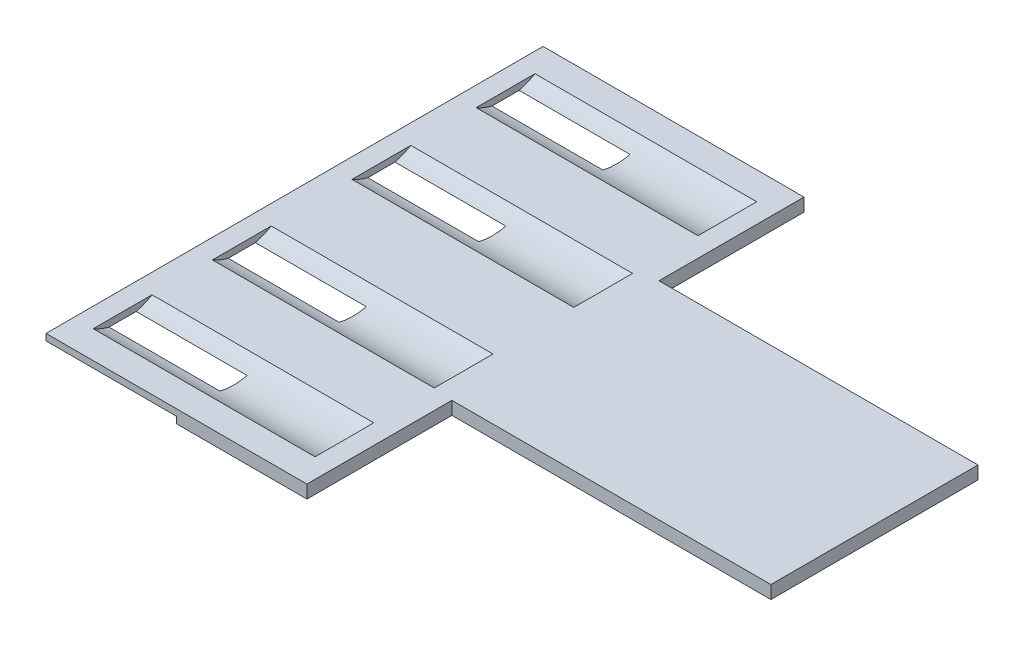
ISO-10303-21;
HEADER;
FILE_DESCRIPTION(('STEP AP214'),'2;1');
FILE_NAME('part.step','',(''),(''),'','','');
FILE_SCHEMA(('AUTOMOTIVE_DESIGN { 1 0 10303 214 1 1 1 1 }'));
ENDSEC;
DATA;
#1=APPLICATION_CONTEXT('core data for automotive mechanical design processes');
#2=APPLICATION_PROTOCOL_DEFINITION('international standard','automotive_design',2000,#1);
#3=PRODUCT_CONTEXT('',#1,'mechanical');
#4=PRODUCT('Part','Part','',(#3));
#5=PRODUCT_RELATED_PRODUCT_CATEGORY('part','',(#4));
#6=PRODUCT_DEFINITION_FORMATION('','',#4);
#7=PRODUCT_DEFINITION_CONTEXT('part definition',#1,'design');
#8=PRODUCT_DEFINITION('design','',#6,#7);
#9=PRODUCT_DEFINITION_SHAPE('','',#8);
#10=(LENGTH_UNIT() NAMED_UNIT(*) SI_UNIT(.MILLI.,.METRE.));
#11=(NAMED_UNIT(*) PLANE_ANGLE_UNIT() SI_UNIT($,.RADIAN.));
#12=(NAMED_UNIT(*) SI_UNIT($,.STERADIAN.) SOLID_ANGLE_UNIT());
#13=UNCERTAINTY_MEASURE_WITH_UNIT(LENGTH_MEASURE(1.E-05),#10,'distance_accuracy_value','');
#14=(GEOMETRIC_REPRESENTATION_CONTEXT(3) GLOBAL_UNCERTAINTY_ASSIGNED_CONTEXT((#13)) GLOBAL_UNIT_ASSIGNED_CONTEXT((#10,
#11,#12)) REPRESENTATION_CONTEXT('',''));
#15=CARTESIAN_POINT('',(0.,0.,0.));
#16=DIRECTION('',(0.,0.,1.));
#17=DIRECTION('',(1.,0.,0.));
#18=AXIS2_PLACEMENT_3D('',#15,#16,#17);
#19=CARTESIAN_POINT('',(-63.5,2.,-76.21));
#20=DIRECTION('',(0.,1.,0.));
#21=DIRECTION('',(0.,0.,1.));
#22=AXIS2_PLACEMENT_3D('',#19,#20,#21);
#23=PLANE('',#22);
#24=DIRECTION('',(1.,0.,0.));
#25=VECTOR('',#24,1.);
#26=CARTESIAN_POINT('',(0.,2.,-76.2));
#27=LINE('',#26,#25);
#28=CARTESIAN_POINT('',(-63.5,2.,-76.2));
#29=VERTEX_POINT('',#28);
#30=CARTESIAN_POINT('',(-23.5,2.,-76.2));
#31=VERTEX_POINT('',#30);
#32=EDGE_CURVE('E317',#29,#31,#27,.T.);
#33=ORIENTED_EDGE('',*,*,#32,.T.);
#34=DIRECTION('',(0.,0.,1.));
#35=VECTOR('',#34,1.);
#36=CARTESIAN_POINT('',(-23.5,2.,-76.21));
#37=LINE('',#36,#35);
#38=CARTESIAN_POINT('',(-23.5,2.00000000000001,-62.8533119314591));
#39=VERTEX_POINT('',#38);
#40=EDGE_CURVE('E54',#31,#39,#37,.T.);
#41=ORIENTED_EDGE('',*,*,#40,.T.);
#42=DIRECTION('',(1.,0.,0.));
#43=VECTOR('',#42,1.);
#44=CARTESIAN_POINT('',(-57.5,2.00000000000001,-62.8533119314591));
#45=LINE('',#44,#43);
#46=CARTESIAN_POINT('',(-57.5,2.,-62.8533119314591));
#47=VERTEX_POINT('',#46);
#48=EDGE_CURVE('E306',#47,#39,#45,.T.);
#49=ORIENTED_EDGE('',*,*,#48,.F.);
#50=DIRECTION('',(0.,0.,1.));
#51=VECTOR('',#50,1.);
#52=CARTESIAN_POINT('',(-57.5,2.,-58.7));
#53=LINE('',#52,#51);
#54=CARTESIAN_POINT('',(-57.5,2.,-54.5466880685409));
#55=VERTEX_POINT('',#54);
#56=EDGE_CURVE('E301',#47,#55,#53,.T.);
#57=ORIENTED_EDGE('',*,*,#56,.T.);
#58=DIRECTION('',(1.,0.,0.));
#59=VECTOR('',#58,1.);
#60=CARTESIAN_POINT('',(-57.5,2.00000000000001,-54.5466880685409));
#61=LINE('',#60,#59);
#62=CARTESIAN_POINT('',(-23.5,2.00000000000001,-54.5466880685409));
#63=VERTEX_POINT('',#62);
#64=EDGE_CURVE('E312',#63,#55,#61,.F.);
#65=ORIENTED_EDGE('',*,*,#64,.F.);
#66=CARTESIAN_POINT('',(-23.5,2.00000000000001,-24.7861871861021));
#67=VERTEX_POINT('',#66);
#68=EDGE_CURVE('E337',#63,#67,#37,.T.);
#69=ORIENTED_EDGE('',*,*,#68,.T.);
#70=DIRECTION('',(1.,0.,0.));
#71=VECTOR('',#70,1.);
#72=CARTESIAN_POINT('',(-57.5,2.00000000000001,-24.7861871861021));
#73=LINE('',#72,#71);
#74=CARTESIAN_POINT('',(-57.5,2.,-24.786187186102));
#75=VERTEX_POINT('',#74);
#76=EDGE_CURVE('E298',#75,#67,#73,.T.);
#77=ORIENTED_EDGE('',*,*,#76,.F.);
#78=DIRECTION('',(0.,0.,1.));
#79=VECTOR('',#78,1.);
#80=CARTESIAN_POINT('',(-57.5,2.,-20.632875254643));
#81=LINE('',#80,#79);
#82=CARTESIAN_POINT('',(-57.5,2.,-16.4795633231839));
#83=VERTEX_POINT('',#82);
#84=EDGE_CURVE('E284',#75,#83,#81,.T.);
#85=ORIENTED_EDGE('',*,*,#84,.T.);
#86=DIRECTION('',(1.,0.,0.));
#87=VECTOR('',#86,1.);
#88=CARTESIAN_POINT('',(-57.5,2.00000000000001,-16.4795633231839));
#89=LINE('',#88,#87);
#90=CARTESIAN_POINT('',(-23.5,2.00000000000001,-16.4795633231839));
#91=VERTEX_POINT('',#90);
#92=EDGE_CURVE('E304',#91,#83,#89,.F.);
#93=ORIENTED_EDGE('',*,*,#92,.F.);
#94=CARTESIAN_POINT('',(-23.5,2.00000000000001,18.0093880106486));
#95=VERTEX_POINT('',#94);
#96=EDGE_CURVE('E336',#91,#95,#37,.T.);
#97=ORIENTED_EDGE('',*,*,#96,.T.);
#98=DIRECTION('',(1.,0.,0.));
#99=VECTOR('',#98,1.);
#100=CARTESIAN_POINT('',(-57.5,2.00000000000001,18.0093880106486));
#101=LINE('',#100,#99);
#102=CARTESIAN_POINT('',(-57.5,2.,18.0093880106486));
#103=VERTEX_POINT('',#102);
#104=EDGE_CURVE('E314',#103,#95,#101,.T.);
#105=ORIENTED_EDGE('',*,*,#104,.F.);
#106=DIRECTION('',(0.,0.,1.));
#107=VECTOR('',#106,1.);
#108=CARTESIAN_POINT('',(-57.5,2.,22.1626999421077));
#109=LINE('',#108,#107);
#110=CARTESIAN_POINT('',(-57.5,2.,26.3160118735668));
#111=VERTEX_POINT('',#110);
#112=EDGE_CURVE('E309',#103,#111,#109,.T.);
#113=ORIENTED_EDGE('',*,*,#112,.T.);
#114=DIRECTION('',(1.,0.,0.));
#115=VECTOR('',#114,1.);
#116=CARTESIAN_POINT('',(-57.5,2.00000000000001,26.3160118735668));
#117=LINE('',#116,#115);
#118=CARTESIAN_POINT('',(-23.5,2.00000000000001,26.3160118735668));
#119=VERTEX_POINT('',#118);
#120=EDGE_CURVE('E290',#119,#111,#117,.F.);
#121=ORIENTED_EDGE('',*,*,#120,.F.);
#122=CARTESIAN_POINT('',(-23.5,2.00000000000001,54.5466880685409));
#123=VERTEX_POINT('',#122);
#124=EDGE_CURVE('E52',#119,#123,#37,.T.);
#125=ORIENTED_EDGE('',*,*,#124,.T.);
#126=DIRECTION('',(1.,0.,0.));
#127=VECTOR('',#126,1.);
#128=CARTESIAN_POINT('',(-57.5,2.00000000000001,54.5466880685409));
#129=LINE('',#128,#127);
#130=CARTESIAN_POINT('',(-57.5,2.,54.5466880685409));
#131=VERTEX_POINT('',#130);
#132=EDGE_CURVE('E282',#131,#123,#129,.T.);
#133=ORIENTED_EDGE('',*,*,#132,.F.);
#134=DIRECTION('',(0.,0.,1.));
#135=VECTOR('',#134,1.);
#136=CARTESIAN_POINT('',(-57.5,2.,58.7));
#137=LINE('',#136,#135);
#138=CARTESIAN_POINT('',(-57.5,2.,62.8533119314591));
#139=VERTEX_POINT('',#138);
#140=EDGE_CURVE('E68',#131,#139,#137,.T.);
#141=ORIENTED_EDGE('',*,*,#140,.T.);
#142=DIRECTION('',(1.,0.,0.));
#143=VECTOR('',#142,1.);
#144=CARTESIAN_POINT('',(-57.5,2.00000000000001,62.8533119314592));
#145=LINE('',#144,#143);
#146=CARTESIAN_POINT('',(-23.5,2.00000000000001,62.8533119314591));
#147=VERTEX_POINT('',#146);
#148=EDGE_CURVE('E61',#147,#139,#145,.F.);
#149=ORIENTED_EDGE('',*,*,#148,.F.);
#150=CARTESIAN_POINT('',(-23.5,2.,76.2));
#151=VERTEX_POINT('',#150);
#152=EDGE_CURVE('E11',#147,#151,#37,.T.);
#153=ORIENTED_EDGE('',*,*,#152,.T.);
#154=DIRECTION('',(1.,0.,0.));
#155=VECTOR('',#154,1.);
#156=CARTESIAN_POINT('',(0.,2.,76.2));
#157=LINE('',#156,#155);
#158=CARTESIAN_POINT('',(-63.5,2.,76.2));
#159=VERTEX_POINT('',#158);
#160=EDGE_CURVE('E291',#159,#151,#157,.T.);
#161=ORIENTED_EDGE('',*,*,#160,.F.);
#162=DIRECTION('',(0.,0.,1.));
#163=VECTOR('',#162,1.);
#164=CARTESIAN_POINT('',(-63.5,2.,-76.21));
#165=LINE('',#164,#163);
#166=EDGE_CURVE('E289',#29,#159,#165,.T.);
#167=ORIENTED_EDGE('',*,*,#166,.F.);
#168=EDGE_LOOP('',(#33,#41,#49,#57,#65,#69,#77,#85,#93,#97,#105,#113,#121,#125,#133,#141,#149,
#153,#161,#167));
#169=FACE_BOUND('',#168,.T.);
#170=ADVANCED_FACE('F43',(#169),#23,.F.);
#171=CARTESIAN_POINT('',(-23.5,2.,-76.21));
#172=DIRECTION('',(1.,0.,0.));
#173=DIRECTION('',(0.,0.,-1.));
#174=AXIS2_PLACEMENT_3D('',#171,#172,#173);
#175=PLANE('',#174);
#176=DIRECTION('',(0.,-1.,0.));
#177=VECTOR('',#176,1.);
#178=CARTESIAN_POINT('',(-23.5,4.,-76.2));
#179=LINE('',#178,#177);
#180=CARTESIAN_POINT('',(-23.5,0.,-76.2));
#181=VERTEX_POINT('',#180);
#182=EDGE_CURVE('E47',#31,#181,#179,.T.);
#183=ORIENTED_EDGE('',*,*,#182,.T.);
#184=DIRECTION('',(0.,0.,-1.));
#185=VECTOR('',#184,1.);
#186=CARTESIAN_POINT('',(-23.5,0.,0.));
#187=LINE('',#186,#185);
#188=CARTESIAN_POINT('',(-23.5,0.,76.2));
#189=VERTEX_POINT('',#188);
#190=EDGE_CURVE('E287',#189,#181,#187,.T.);
#191=ORIENTED_EDGE('',*,*,#190,.F.);
#192=DIRECTION('',(0.,-1.,0.));
#193=VECTOR('',#192,1.);
#194=CARTESIAN_POINT('',(-23.5,4.,76.2));
#195=LINE('',#194,#193);
#196=EDGE_CURVE('E293',#151,#189,#195,.T.);
#197=ORIENTED_EDGE('',*,*,#196,.F.);
#198=ORIENTED_EDGE('',*,*,#152,.F.);
#199=CARTESIAN_POINT('',(-23.5,19.,58.7));
#200=DIRECTION('',(1.,0.,0.));
#201=DIRECTION('',(0.,0.,-1.));
#202=AXIS2_PLACEMENT_3D('',#199,#200,#201);
#203=CIRCLE('',#202,17.5);
#204=EDGE_CURVE('E285',#123,#147,#203,.F.);
#205=ORIENTED_EDGE('',*,*,#204,.F.);
#206=ORIENTED_EDGE('',*,*,#124,.F.);
#207=CARTESIAN_POINT('',(-23.5,19.,22.1626999421077));
#208=DIRECTION('',(1.,0.,0.));
#209=DIRECTION('',(0.,0.,-1.));
#210=AXIS2_PLACEMENT_3D('',#207,#208,#209);
#211=CIRCLE('',#210,17.5);
#212=EDGE_CURVE('E319',#95,#119,#211,.F.);
#213=ORIENTED_EDGE('',*,*,#212,.F.);
#214=ORIENTED_EDGE('',*,*,#96,.F.);
#215=CARTESIAN_POINT('',(-23.5,19.,-20.632875254643));
#216=DIRECTION('',(1.,0.,0.));
#217=DIRECTION('',(0.,0.,-1.));
#218=AXIS2_PLACEMENT_3D('',#215,#216,#217);
#219=CIRCLE('',#218,17.5);
#220=EDGE_CURVE('E303',#67,#91,#219,.F.);
#221=ORIENTED_EDGE('',*,*,#220,.F.);
#222=ORIENTED_EDGE('',*,*,#68,.F.);
#223=CARTESIAN_POINT('',(-23.5,19.,-58.7));
#224=DIRECTION('',(1.,0.,0.));
#225=DIRECTION('',(0.,0.,-1.));
#226=AXIS2_PLACEMENT_3D('',#223,#224,#225);
#227=CIRCLE('',#226,17.5);
#228=EDGE_CURVE('E311',#39,#63,#227,.F.);
#229=ORIENTED_EDGE('',*,*,#228,.F.);
#230=ORIENTED_EDGE('',*,*,#40,.F.);
#231=EDGE_LOOP('',(#183,#191,#197,#198,#205,#206,#213,#214,#221,#222,#229,#230));
#232=FACE_BOUND('',#231,.T.);
#233=ADVANCED_FACE('F45',(#232),#175,.F.);
#234=CARTESIAN_POINT('',(0.,4.,76.2));
#235=DIRECTION('',(0.,0.,-1.));
#236=DIRECTION('',(-1.,0.,0.));
#237=AXIS2_PLACEMENT_3D('',#234,#235,#236);
#238=PLANE('',#237);
#239=ORIENTED_EDGE('',*,*,#160,.T.);
#240=ORIENTED_EDGE('',*,*,#196,.T.);
#241=DIRECTION('',(1.,0.,0.));
#242=VECTOR('',#241,1.);
#243=CARTESIAN_POINT('',(0.,0.,76.2));
#244=LINE('',#243,#242);
#245=CARTESIAN_POINT('',(16.5,0.,76.2));
#246=VERTEX_POINT('',#245);
#247=EDGE_CURVE('E388',#189,#246,#244,.T.);
#248=ORIENTED_EDGE('',*,*,#247,.T.);
#249=DIRECTION('',(0.,-1.,0.));
#250=VECTOR('',#249,1.);
#251=CARTESIAN_POINT('',(16.5,4.,76.2));
#252=LINE('',#251,#250);
#253=CARTESIAN_POINT('',(16.5,4.,76.2));
#254=VERTEX_POINT('',#253);
#255=EDGE_CURVE('E420',#254,#246,#252,.T.);
#256=ORIENTED_EDGE('',*,*,#255,.F.);
#257=DIRECTION('',(1.,0.,0.));
#258=VECTOR('',#257,1.);
#259=CARTESIAN_POINT('',(0.,4.,76.2));
#260=LINE('',#259,#258);
#261=CARTESIAN_POINT('',(-63.5,4.,76.2));
#262=VERTEX_POINT('',#261);
#263=EDGE_CURVE('E369',#262,#254,#260,.T.);
#264=ORIENTED_EDGE('',*,*,#263,.F.);
#265=DIRECTION('',(0.,-1.,0.));
#266=VECTOR('',#265,1.);
#267=CARTESIAN_POINT('',(-63.5,4.,76.2));
#268=LINE('',#267,#266);
#269=EDGE_CURVE('E228',#262,#159,#268,.T.);
#270=ORIENTED_EDGE('',*,*,#269,.T.);
#271=EDGE_LOOP('',(#239,#240,#248,#256,#264,#270));
#272=FACE_BOUND('',#271,.T.);
#273=ADVANCED_FACE('F426',(#272),#238,.F.);
#274=CARTESIAN_POINT('',(10.5,19.,22.1626999421077));
#275=DIRECTION('',(1.,0.,0.));
#276=DIRECTION('',(0.,0.,-1.));
#277=AXIS2_PLACEMENT_3D('',#274,#275,#276);
#278=PLANE('',#277);
#279=DIRECTION('',(0.,0.,-1.));
#280=VECTOR('',#279,1.);
#281=CARTESIAN_POINT('',(10.5,4.,0.));
#282=LINE('',#281,#280);
#283=CARTESIAN_POINT('',(10.5,4.,31.1765781307677));
#284=VERTEX_POINT('',#283);
#285=CARTESIAN_POINT('',(10.5,4.,13.1488217534477));
#286=VERTEX_POINT('',#285);
#287=EDGE_CURVE('E219',#284,#286,#282,.T.);
#288=ORIENTED_EDGE('',*,*,#287,.T.);
#289=CARTESIAN_POINT('',(10.5,19.,22.1626999421077));
#290=DIRECTION('',(1.,0.,0.));
#291=DIRECTION('',(0.,0.,-1.));
#292=AXIS2_PLACEMENT_3D('',#289,#290,#291);
#293=CIRCLE('',#292,17.5);
#294=EDGE_CURVE('E222',#284,#286,#293,.T.);
#295=ORIENTED_EDGE('',*,*,#294,.F.);
#296=EDGE_LOOP('',(#288,#295));
#297=FACE_BOUND('',#296,.T.);
#298=ADVANCED_FACE('F221',(#297),#278,.F.);
#299=CARTESIAN_POINT('',(10.5,19.,-58.7));
#300=DIRECTION('',(1.,0.,0.));
#301=DIRECTION('',(0.,0.,-1.));
#302=AXIS2_PLACEMENT_3D('',#299,#300,#301);
#303=PLANE('',#302);
#304=DIRECTION('',(0.,0.,-1.));
#305=VECTOR('',#304,1.);
#306=CARTESIAN_POINT('',(10.5,4.,0.));
#307=LINE('',#306,#305);
#308=CARTESIAN_POINT('',(10.5,4.,-49.68612181134));
#309=VERTEX_POINT('',#308);
#310=CARTESIAN_POINT('',(10.5,4.,-67.71387818866));
#311=VERTEX_POINT('',#310);
#312=EDGE_CURVE('E249',#309,#311,#307,.T.);
#313=ORIENTED_EDGE('',*,*,#312,.T.);
#314=CARTESIAN_POINT('',(10.5,19.,-58.7));
#315=DIRECTION('',(1.,0.,0.));
#316=DIRECTION('',(0.,0.,-1.));
#317=AXIS2_PLACEMENT_3D('',#314,#315,#316);
#318=CIRCLE('',#317,17.5);
#319=EDGE_CURVE('E360',#309,#311,#318,.T.);
#320=ORIENTED_EDGE('',*,*,#319,.F.);
#321=EDGE_LOOP('',(#313,#320));
#322=FACE_BOUND('',#321,.T.);
#323=ADVANCED_FACE('F502',(#322),#303,.F.);
#324=CARTESIAN_POINT('',(10.5,19.,-20.632875254643));
#325=DIRECTION('',(1.,0.,0.));
#326=DIRECTION('',(0.,0.,-1.));
#327=AXIS2_PLACEMENT_3D('',#324,#325,#326);
#328=PLANE('',#327);
#329=DIRECTION('',(0.,0.,-1.));
#330=VECTOR('',#329,1.);
#331=CARTESIAN_POINT('',(10.5,4.,0.));
#332=LINE('',#331,#330);
#333=CARTESIAN_POINT('',(10.5,4.,-11.618997065983));
#334=VERTEX_POINT('',#333);
#335=CARTESIAN_POINT('',(10.5,4.,-29.646753443303));
#336=VERTEX_POINT('',#335);
#337=EDGE_CURVE('E260',#334,#336,#332,.T.);
#338=ORIENTED_EDGE('',*,*,#337,.T.);
#339=CARTESIAN_POINT('',(10.5,19.,-20.632875254643));
#340=DIRECTION('',(1.,0.,0.));
#341=DIRECTION('',(0.,0.,-1.));
#342=AXIS2_PLACEMENT_3D('',#339,#340,#341);
#343=CIRCLE('',#342,17.5);
#344=EDGE_CURVE('E357',#334,#336,#343,.T.);
#345=ORIENTED_EDGE('',*,*,#344,.F.);
#346=EDGE_LOOP('',(#338,#345));
#347=FACE_BOUND('',#346,.T.);
#348=ADVANCED_FACE('F505',(#347),#328,.F.);
#349=CARTESIAN_POINT('',(10.5,19.,58.7));
#350=DIRECTION('',(1.,0.,0.));
#351=DIRECTION('',(0.,0.,-1.));
#352=AXIS2_PLACEMENT_3D('',#349,#350,#351);
#353=PLANE('',#352);
#354=DIRECTION('',(0.,0.,-1.));
#355=VECTOR('',#354,1.);
#356=CARTESIAN_POINT('',(10.5,4.,0.));
#357=LINE('',#356,#355);
#358=CARTESIAN_POINT('',(10.5,4.,67.71387818866));
#359=VERTEX_POINT('',#358);
#360=CARTESIAN_POINT('',(10.5,4.,49.68612181134));
#361=VERTEX_POINT('',#360);
#362=EDGE_CURVE('E271',#359,#361,#357,.T.);
#363=ORIENTED_EDGE('',*,*,#362,.T.);
#364=CARTESIAN_POINT('',(10.5,19.,58.7));
#365=DIRECTION('',(1.,0.,0.));
#366=DIRECTION('',(0.,0.,-1.));
#367=AXIS2_PLACEMENT_3D('',#364,#365,#366);
#368=CIRCLE('',#367,17.5);
#369=EDGE_CURVE('E238',#359,#361,#368,.T.);
#370=ORIENTED_EDGE('',*,*,#369,.F.);
#371=EDGE_LOOP('',(#363,#370));
#372=FACE_BOUND('',#371,.T.);
#373=ADVANCED_FACE('F512',(#372),#353,.F.);
#374=CARTESIAN_POINT('',(0.,4.,0.));
#375=DIRECTION('',(0.,1.,0.));
#376=DIRECTION('',(0.,0.,1.));
#377=AXIS2_PLACEMENT_3D('',#374,#375,#376);
#378=PLANE('',#377);
#379=DIRECTION('',(1.,0.,0.));
#380=VECTOR('',#379,1.);
#381=CARTESIAN_POINT('',(0.,4.,-76.2));
#382=LINE('',#381,#380);
#383=CARTESIAN_POINT('',(-63.5,4.,-76.2));
#384=VERTEX_POINT('',#383);
#385=CARTESIAN_POINT('',(16.5,4.,-76.2));
#386=VERTEX_POINT('',#385);
#387=EDGE_CURVE('E384',#384,#386,#382,.T.);
#388=ORIENTED_EDGE('',*,*,#387,.F.);
#389=DIRECTION('',(0.,0.,1.));
#390=VECTOR('',#389,1.);
#391=CARTESIAN_POINT('',(-63.5,4.,0.));
#392=LINE('',#391,#390);
#393=EDGE_CURVE('E367',#384,#262,#392,.T.);
#394=ORIENTED_EDGE('',*,*,#393,.T.);
#395=ORIENTED_EDGE('',*,*,#263,.T.);
#396=DIRECTION('',(0.,0.,-1.));
#397=VECTOR('',#396,1.);
#398=CARTESIAN_POINT('',(16.5,4.,0.));
#399=LINE('',#398,#397);
#400=CARTESIAN_POINT('',(16.5,4.,31.75));
#401=VERTEX_POINT('',#400);
#402=EDGE_CURVE('E372',#254,#401,#399,.T.);
#403=ORIENTED_EDGE('',*,*,#402,.T.);
#404=DIRECTION('',(1.,0.,0.));
#405=VECTOR('',#404,1.);
#406=CARTESIAN_POINT('',(0.,4.,31.75));
#407=LINE('',#406,#405);
#408=CARTESIAN_POINT('',(114.3,4.,31.75));
#409=VERTEX_POINT('',#408);
#410=EDGE_CURVE('E374',#401,#409,#407,.T.);
#411=ORIENTED_EDGE('',*,*,#410,.T.);
#412=DIRECTION('',(0.,0.,-1.));
#413=VECTOR('',#412,1.);
#414=CARTESIAN_POINT('',(114.3,4.,0.));
#415=LINE('',#414,#413);
#416=CARTESIAN_POINT('',(114.3,4.,-31.75));
#417=VERTEX_POINT('',#416);
#418=EDGE_CURVE('E376',#409,#417,#415,.T.);
#419=ORIENTED_EDGE('',*,*,#418,.T.);
#420=DIRECTION('',(1.,0.,0.));
#421=VECTOR('',#420,1.);
#422=CARTESIAN_POINT('',(0.,4.,-31.75));
#423=LINE('',#422,#421);
#424=CARTESIAN_POINT('',(16.5,4.,-31.75));
#425=VERTEX_POINT('',#424);
#426=EDGE_CURVE('E378',#425,#417,#423,.T.);
#427=ORIENTED_EDGE('',*,*,#426,.F.);
#428=DIRECTION('',(0.,0.,1.));
#429=VECTOR('',#428,1.);
#430=CARTESIAN_POINT('',(16.5,4.,0.));
#431=LINE('',#430,#429);
#432=EDGE_CURVE('E381',#386,#425,#431,.T.);
#433=ORIENTED_EDGE('',*,*,#432,.F.);
#434=EDGE_LOOP('',(#388,#394,#395,#403,#411,#419,#427,#433));
#435=FACE_BOUND('',#434,.T.);
#436=DIRECTION('',(1.,0.,0.));
#437=VECTOR('',#436,1.);
#438=CARTESIAN_POINT('',(-57.5,4.,31.1765781307677));
#439=LINE('',#438,#437);
#440=CARTESIAN_POINT('',(-57.5,4.,31.1765781307677));
#441=VERTEX_POINT('',#440);
#442=EDGE_CURVE('E237',#441,#284,#439,.T.);
#443=ORIENTED_EDGE('',*,*,#442,.F.);
#444=DIRECTION('',(0.,0.,-1.));
#445=VECTOR('',#444,1.);
#446=CARTESIAN_POINT('',(-57.5,4.,0.));
#447=LINE('',#446,#445);
#448=CARTESIAN_POINT('',(-57.5,4.,13.1488217534477));
#449=VERTEX_POINT('',#448);
#450=EDGE_CURVE('E243',#441,#449,#447,.T.);
#451=ORIENTED_EDGE('',*,*,#450,.T.);
#452=DIRECTION('',(1.,0.,0.));
#453=VECTOR('',#452,1.);
#454=CARTESIAN_POINT('',(-57.5,4.,13.1488217534477));
#455=LINE('',#454,#453);
#456=EDGE_CURVE('E227',#286,#449,#455,.F.);
#457=ORIENTED_EDGE('',*,*,#456,.F.);
#458=ORIENTED_EDGE('',*,*,#287,.F.);
#459=EDGE_LOOP('',(#443,#451,#457,#458));
#460=FACE_BOUND('',#459,.T.);
#461=DIRECTION('',(1.,0.,0.));
#462=VECTOR('',#461,1.);
#463=CARTESIAN_POINT('',(-57.5,4.,-49.68612181134));
#464=LINE('',#463,#462);
#465=CARTESIAN_POINT('',(-57.5,4.,-49.68612181134));
#466=VERTEX_POINT('',#465);
#467=EDGE_CURVE('E254',#466,#309,#464,.T.);
#468=ORIENTED_EDGE('',*,*,#467,.F.);
#469=DIRECTION('',(0.,0.,-1.));
#470=VECTOR('',#469,1.);
#471=CARTESIAN_POINT('',(-57.5,4.,0.));
#472=LINE('',#471,#470);
#473=CARTESIAN_POINT('',(-57.5,4.,-67.71387818866));
#474=VERTEX_POINT('',#473);
#475=EDGE_CURVE('E257',#466,#474,#472,.T.);
#476=ORIENTED_EDGE('',*,*,#475,.T.);
#477=DIRECTION('',(1.,0.,0.));
#478=VECTOR('',#477,1.);
#479=CARTESIAN_POINT('',(-57.5,4.,-67.71387818866));
#480=LINE('',#479,#478);
#481=EDGE_CURVE('E251',#311,#474,#480,.F.);
#482=ORIENTED_EDGE('',*,*,#481,.F.);
#483=ORIENTED_EDGE('',*,*,#312,.F.);
#484=EDGE_LOOP('',(#468,#476,#482,#483));
#485=FACE_BOUND('',#484,.T.);
#486=DIRECTION('',(1.,0.,0.));
#487=VECTOR('',#486,1.);
#488=CARTESIAN_POINT('',(-57.5,4.,-11.618997065983));
#489=LINE('',#488,#487);
#490=CARTESIAN_POINT('',(-57.5,4.,-11.618997065983));
#491=VERTEX_POINT('',#490);
#492=EDGE_CURVE('E265',#491,#334,#489,.T.);
#493=ORIENTED_EDGE('',*,*,#492,.F.);
#494=DIRECTION('',(0.,0.,-1.));
#495=VECTOR('',#494,1.);
#496=CARTESIAN_POINT('',(-57.5,4.,0.));
#497=LINE('',#496,#495);
#498=CARTESIAN_POINT('',(-57.5,4.,-29.646753443303));
#499=VERTEX_POINT('',#498);
#500=EDGE_CURVE('E268',#491,#499,#497,.T.);
#501=ORIENTED_EDGE('',*,*,#500,.T.);
#502=DIRECTION('',(1.,0.,0.));
#503=VECTOR('',#502,1.);
#504=CARTESIAN_POINT('',(-57.5,4.,-29.646753443303));
#505=LINE('',#504,#503);
#506=EDGE_CURVE('E262',#336,#499,#505,.F.);
#507=ORIENTED_EDGE('',*,*,#506,.F.);
#508=ORIENTED_EDGE('',*,*,#337,.F.);
#509=EDGE_LOOP('',(#493,#501,#507,#508));
#510=FACE_BOUND('',#509,.T.);
#511=DIRECTION('',(1.,0.,0.));
#512=VECTOR('',#511,1.);
#513=CARTESIAN_POINT('',(-57.5,4.,67.71387818866));
#514=LINE('',#513,#512);
#515=CARTESIAN_POINT('',(-57.5,4.,67.71387818866));
#516=VERTEX_POINT('',#515);
#517=EDGE_CURVE('E276',#516,#359,#514,.T.);
#518=ORIENTED_EDGE('',*,*,#517,.F.);
#519=DIRECTION('',(0.,0.,-1.));
#520=VECTOR('',#519,1.);
#521=CARTESIAN_POINT('',(-57.5,4.,0.));
#522=LINE('',#521,#520);
#523=CARTESIAN_POINT('',(-57.5,4.,49.68612181134));
#524=VERTEX_POINT('',#523);
#525=EDGE_CURVE('E279',#516,#524,#522,.T.);
#526=ORIENTED_EDGE('',*,*,#525,.T.);
#527=DIRECTION('',(1.,0.,0.));
#528=VECTOR('',#527,1.);
#529=CARTESIAN_POINT('',(-57.5,4.,49.68612181134));
#530=LINE('',#529,#528);
#531=EDGE_CURVE('E273',#361,#524,#530,.F.);
#532=ORIENTED_EDGE('',*,*,#531,.F.);
#533=ORIENTED_EDGE('',*,*,#362,.F.);
#534=EDGE_LOOP('',(#518,#526,#532,#533));
#535=FACE_BOUND('',#534,.T.);
#536=ADVANCED_FACE('F241',(#435,#460,#485,#510,#535),#378,.T.);
#537=CARTESIAN_POINT('',(-57.5,19.,58.7));
#538=DIRECTION('',(1.,0.,0.));
#539=DIRECTION('',(0.,0.,-1.));
#540=AXIS2_PLACEMENT_3D('',#537,#538,#539);
#541=CYLINDRICAL_SURFACE('',#540,17.5);
#542=ORIENTED_EDGE('',*,*,#204,.T.);
#543=ORIENTED_EDGE('',*,*,#148,.T.);
#544=CARTESIAN_POINT('',(-57.5,19.,58.7));
#545=DIRECTION('',(1.,0.,0.));
#546=DIRECTION('',(0.,0.,-1.));
#547=AXIS2_PLACEMENT_3D('',#544,#545,#546);
#548=CIRCLE('',#547,17.5);
#549=EDGE_CURVE('E391',#516,#139,#548,.T.);
#550=ORIENTED_EDGE('',*,*,#549,.F.);
#551=ORIENTED_EDGE('',*,*,#517,.T.);
#552=ORIENTED_EDGE('',*,*,#369,.T.);
#553=ORIENTED_EDGE('',*,*,#531,.T.);
#554=EDGE_CURVE('E735',#131,#524,#548,.T.);
#555=ORIENTED_EDGE('',*,*,#554,.F.);
#556=ORIENTED_EDGE('',*,*,#132,.T.);
#557=EDGE_LOOP('',(#542,#543,#550,#551,#552,#553,#555,#556));
#558=FACE_BOUND('',#557,.T.);
#559=ADVANCED_FACE('F511',(#558),#541,.F.);
#560=CARTESIAN_POINT('',(-57.5,19.,58.7));
#561=DIRECTION('',(1.,0.,0.));
#562=DIRECTION('',(0.,0.,-1.));
#563=AXIS2_PLACEMENT_3D('',#560,#561,#562);
#564=PLANE('',#563);
#565=ORIENTED_EDGE('',*,*,#140,.F.);
#566=ORIENTED_EDGE('',*,*,#554,.T.);
#567=ORIENTED_EDGE('',*,*,#525,.F.);
#568=ORIENTED_EDGE('',*,*,#549,.T.);
#569=EDGE_LOOP('',(#565,#566,#567,#568));
#570=FACE_BOUND('',#569,.T.);
#571=ADVANCED_FACE('F632',(#570),#564,.T.);
#572=CARTESIAN_POINT('',(-57.5,19.,-20.632875254643));
#573=DIRECTION('',(1.,0.,0.));
#574=DIRECTION('',(0.,0.,-1.));
#575=AXIS2_PLACEMENT_3D('',#572,#573,#574);
#576=CYLINDRICAL_SURFACE('',#575,17.5);
#577=ORIENTED_EDGE('',*,*,#220,.T.);
#578=ORIENTED_EDGE('',*,*,#92,.T.);
#579=CARTESIAN_POINT('',(-57.5,19.,-20.632875254643));
#580=DIRECTION('',(1.,0.,0.));
#581=DIRECTION('',(0.,0.,-1.));
#582=AXIS2_PLACEMENT_3D('',#579,#580,#581);
#583=CIRCLE('',#582,17.5);
#584=EDGE_CURVE('E362',#491,#83,#583,.T.);
#585=ORIENTED_EDGE('',*,*,#584,.F.);
#586=ORIENTED_EDGE('',*,*,#492,.T.);
#587=ORIENTED_EDGE('',*,*,#344,.T.);
#588=ORIENTED_EDGE('',*,*,#506,.T.);
#589=EDGE_CURVE('E726',#75,#499,#583,.T.);
#590=ORIENTED_EDGE('',*,*,#589,.F.);
#591=ORIENTED_EDGE('',*,*,#76,.T.);
#592=EDGE_LOOP('',(#577,#578,#585,#586,#587,#588,#590,#591));
#593=FACE_BOUND('',#592,.T.);
#594=ADVANCED_FACE('F620',(#593),#576,.F.);
#595=CARTESIAN_POINT('',(-57.5,19.,-20.632875254643));
#596=DIRECTION('',(1.,0.,0.));
#597=DIRECTION('',(0.,0.,-1.));
#598=AXIS2_PLACEMENT_3D('',#595,#596,#597);
#599=PLANE('',#598);
#600=ORIENTED_EDGE('',*,*,#84,.F.);
#601=ORIENTED_EDGE('',*,*,#589,.T.);
#602=ORIENTED_EDGE('',*,*,#500,.F.);
#603=ORIENTED_EDGE('',*,*,#584,.T.);
#604=EDGE_LOOP('',(#600,#601,#602,#603));
#605=FACE_BOUND('',#604,.T.);
#606=ADVANCED_FACE('F501',(#605),#599,.T.);
#607=CARTESIAN_POINT('',(-57.5,19.,-58.7));
#608=DIRECTION('',(1.,0.,0.));
#609=DIRECTION('',(0.,0.,-1.));
#610=AXIS2_PLACEMENT_3D('',#607,#608,#609);
#611=CYLINDRICAL_SURFACE('',#610,17.5);
#612=ORIENTED_EDGE('',*,*,#228,.T.);
#613=ORIENTED_EDGE('',*,*,#64,.T.);
#614=CARTESIAN_POINT('',(-57.5,19.,-58.7));
#615=DIRECTION('',(1.,0.,0.));
#616=DIRECTION('',(0.,0.,-1.));
#617=AXIS2_PLACEMENT_3D('',#614,#615,#616);
#618=CIRCLE('',#617,17.5);
#619=EDGE_CURVE('E356',#466,#55,#618,.T.);
#620=ORIENTED_EDGE('',*,*,#619,.F.);
#621=ORIENTED_EDGE('',*,*,#467,.T.);
#622=ORIENTED_EDGE('',*,*,#319,.T.);
#623=ORIENTED_EDGE('',*,*,#481,.T.);
#624=EDGE_CURVE('E352',#47,#474,#618,.T.);
#625=ORIENTED_EDGE('',*,*,#624,.F.);
#626=ORIENTED_EDGE('',*,*,#48,.T.);
#627=EDGE_LOOP('',(#612,#613,#620,#621,#622,#623,#625,#626));
#628=FACE_BOUND('',#627,.T.);
#629=ADVANCED_FACE('F350',(#628),#611,.F.);
#630=CARTESIAN_POINT('',(-57.5,19.,-58.7));
#631=DIRECTION('',(1.,0.,0.));
#632=DIRECTION('',(0.,0.,-1.));
#633=AXIS2_PLACEMENT_3D('',#630,#631,#632);
#634=PLANE('',#633);
#635=ORIENTED_EDGE('',*,*,#56,.F.);
#636=ORIENTED_EDGE('',*,*,#624,.T.);
#637=ORIENTED_EDGE('',*,*,#475,.F.);
#638=ORIENTED_EDGE('',*,*,#619,.T.);
#639=EDGE_LOOP('',(#635,#636,#637,#638));
#640=FACE_BOUND('',#639,.T.);
#641=ADVANCED_FACE('F495',(#640),#634,.T.);
#642=CARTESIAN_POINT('',(-57.5,19.,22.1626999421077));
#643=DIRECTION('',(1.,0.,0.));
#644=DIRECTION('',(0.,0.,-1.));
#645=AXIS2_PLACEMENT_3D('',#642,#643,#644);
#646=CYLINDRICAL_SURFACE('',#645,17.5);
#647=ORIENTED_EDGE('',*,*,#212,.T.);
#648=ORIENTED_EDGE('',*,*,#120,.T.);
#649=CARTESIAN_POINT('',(-57.5,19.,22.1626999421077));
#650=DIRECTION('',(1.,0.,0.));
#651=DIRECTION('',(0.,0.,-1.));
#652=AXIS2_PLACEMENT_3D('',#649,#650,#651);
#653=CIRCLE('',#652,17.5);
#654=EDGE_CURVE('E239',#441,#111,#653,.T.);
#655=ORIENTED_EDGE('',*,*,#654,.F.);
#656=ORIENTED_EDGE('',*,*,#442,.T.);
#657=ORIENTED_EDGE('',*,*,#294,.T.);
#658=ORIENTED_EDGE('',*,*,#456,.T.);
#659=EDGE_CURVE('E730',#103,#449,#653,.T.);
#660=ORIENTED_EDGE('',*,*,#659,.F.);
#661=ORIENTED_EDGE('',*,*,#104,.T.);
#662=EDGE_LOOP('',(#647,#648,#655,#656,#657,#658,#660,#661));
#663=FACE_BOUND('',#662,.T.);
#664=ADVANCED_FACE('F233',(#663),#646,.F.);
#665=CARTESIAN_POINT('',(-57.5,19.,22.1626999421077));
#666=DIRECTION('',(1.,0.,0.));
#667=DIRECTION('',(0.,0.,-1.));
#668=AXIS2_PLACEMENT_3D('',#665,#666,#667);
#669=PLANE('',#668);
#670=ORIENTED_EDGE('',*,*,#112,.F.);
#671=ORIENTED_EDGE('',*,*,#659,.T.);
#672=ORIENTED_EDGE('',*,*,#450,.F.);
#673=ORIENTED_EDGE('',*,*,#654,.T.);
#674=EDGE_LOOP('',(#670,#671,#672,#673));
#675=FACE_BOUND('',#674,.T.);
#676=ADVANCED_FACE('F486',(#675),#669,.T.);
#677=CARTESIAN_POINT('',(0.,4.,31.75));
#678=DIRECTION('',(0.,0.,-1.));
#679=DIRECTION('',(-1.,0.,0.));
#680=AXIS2_PLACEMENT_3D('',#677,#678,#679);
#681=PLANE('',#680);
#682=DIRECTION('',(1.,0.,0.));
#683=VECTOR('',#682,1.);
#684=CARTESIAN_POINT('',(0.,0.,31.75));
#685=LINE('',#684,#683);
#686=CARTESIAN_POINT('',(16.5,0.,31.75));
#687=VERTEX_POINT('',#686);
#688=CARTESIAN_POINT('',(114.3,0.,31.75));
#689=VERTEX_POINT('',#688);
#690=EDGE_CURVE('E393',#687,#689,#685,.T.);
#691=ORIENTED_EDGE('',*,*,#690,.T.);
#692=DIRECTION('',(0.,-1.,0.));
#693=VECTOR('',#692,1.);
#694=CARTESIAN_POINT('',(114.3,4.,31.75));
#695=LINE('',#694,#693);
#696=EDGE_CURVE('E414',#409,#689,#695,.T.);
#697=ORIENTED_EDGE('',*,*,#696,.F.);
#698=ORIENTED_EDGE('',*,*,#410,.F.);
#699=DIRECTION('',(0.,-1.,0.));
#700=VECTOR('',#699,1.);
#701=CARTESIAN_POINT('',(16.5,4.,31.75));
#702=LINE('',#701,#700);
#703=EDGE_CURVE('E417',#401,#687,#702,.T.);
#704=ORIENTED_EDGE('',*,*,#703,.T.);
#705=EDGE_LOOP('',(#691,#697,#698,#704));
#706=FACE_BOUND('',#705,.T.);
#707=ADVANCED_FACE('F446',(#706),#681,.F.);
#708=CARTESIAN_POINT('',(16.5,4.,0.));
#709=DIRECTION('',(-1.,0.,0.));
#710=DIRECTION('',(0.,0.,1.));
#711=AXIS2_PLACEMENT_3D('',#708,#709,#710);
#712=PLANE('',#711);
#713=DIRECTION('',(0.,0.,-1.));
#714=VECTOR('',#713,1.);
#715=CARTESIAN_POINT('',(16.5,0.,0.));
#716=LINE('',#715,#714);
#717=EDGE_CURVE('E390',#246,#687,#716,.T.);
#718=ORIENTED_EDGE('',*,*,#717,.T.);
#719=ORIENTED_EDGE('',*,*,#703,.F.);
#720=ORIENTED_EDGE('',*,*,#402,.F.);
#721=ORIENTED_EDGE('',*,*,#255,.T.);
#722=EDGE_LOOP('',(#718,#719,#720,#721));
#723=FACE_BOUND('',#722,.T.);
#724=ADVANCED_FACE('F439',(#723),#712,.F.);
#725=CARTESIAN_POINT('',(114.3,4.,0.));
#726=DIRECTION('',(-1.,0.,0.));
#727=DIRECTION('',(0.,0.,1.));
#728=AXIS2_PLACEMENT_3D('',#725,#726,#727);
#729=PLANE('',#728);
#730=DIRECTION('',(0.,0.,-1.));
#731=VECTOR('',#730,1.);
#732=CARTESIAN_POINT('',(114.3,0.,0.));
#733=LINE('',#732,#731);
#734=CARTESIAN_POINT('',(114.3,0.,-31.75));
#735=VERTEX_POINT('',#734);
#736=EDGE_CURVE('E395',#689,#735,#733,.T.);
#737=ORIENTED_EDGE('',*,*,#736,.T.);
#738=DIRECTION('',(0.,-1.,0.));
#739=VECTOR('',#738,1.);
#740=CARTESIAN_POINT('',(114.3,4.,-31.75));
#741=LINE('',#740,#739);
#742=EDGE_CURVE('E412',#417,#735,#741,.T.);
#743=ORIENTED_EDGE('',*,*,#742,.F.);
#744=ORIENTED_EDGE('',*,*,#418,.F.);
#745=ORIENTED_EDGE('',*,*,#696,.T.);
#746=EDGE_LOOP('',(#737,#743,#744,#745));
#747=FACE_BOUND('',#746,.T.);
#748=ADVANCED_FACE('F450',(#747),#729,.F.);
#749=CARTESIAN_POINT('',(0.,4.,-31.75));
#750=DIRECTION('',(0.,0.,-1.));
#751=DIRECTION('',(-1.,0.,0.));
#752=AXIS2_PLACEMENT_3D('',#749,#750,#751);
#753=PLANE('',#752);
#754=DIRECTION('',(1.,0.,0.));
#755=VECTOR('',#754,1.);
#756=CARTESIAN_POINT('',(0.,0.,-31.75));
#757=LINE('',#756,#755);
#758=CARTESIAN_POINT('',(16.5,0.,-31.75));
#759=VERTEX_POINT('',#758);
#760=EDGE_CURVE('E398',#759,#735,#757,.T.);
#761=ORIENTED_EDGE('',*,*,#760,.F.);
#762=DIRECTION('',(0.,-1.,0.));
#763=VECTOR('',#762,1.);
#764=CARTESIAN_POINT('',(16.5,4.,-31.75));
#765=LINE('',#764,#763);
#766=EDGE_CURVE('E410',#425,#759,#765,.T.);
#767=ORIENTED_EDGE('',*,*,#766,.F.);
#768=ORIENTED_EDGE('',*,*,#426,.T.);
#769=ORIENTED_EDGE('',*,*,#742,.T.);
#770=EDGE_LOOP('',(#761,#767,#768,#769));
#771=FACE_BOUND('',#770,.T.);
#772=ADVANCED_FACE('F464',(#771),#753,.T.);
#773=CARTESIAN_POINT('',(0.,4.,-76.2));
#774=DIRECTION('',(0.,0.,-1.));
#775=DIRECTION('',(-1.,0.,0.));
#776=AXIS2_PLACEMENT_3D('',#773,#774,#775);
#777=PLANE('',#776);
#778=ORIENTED_EDGE('',*,*,#182,.F.);
#779=ORIENTED_EDGE('',*,*,#32,.F.);
#780=DIRECTION('',(0.,-1.,0.));
#781=VECTOR('',#780,1.);
#782=CARTESIAN_POINT('',(-63.5,4.,-76.2));
#783=LINE('',#782,#781);
#784=EDGE_CURVE('E387',#384,#29,#783,.T.);
#785=ORIENTED_EDGE('',*,*,#784,.F.);
#786=ORIENTED_EDGE('',*,*,#387,.T.);
#787=DIRECTION('',(0.,-1.,0.));
#788=VECTOR('',#787,1.);
#789=CARTESIAN_POINT('',(16.5,4.,-76.2));
#790=LINE('',#789,#788);
#791=CARTESIAN_POINT('',(16.5,0.,-76.2));
#792=VERTEX_POINT('',#791);
#793=EDGE_CURVE('E407',#386,#792,#790,.T.);
#794=ORIENTED_EDGE('',*,*,#793,.T.);
#795=DIRECTION('',(1.,0.,0.));
#796=VECTOR('',#795,1.);
#797=CARTESIAN_POINT('',(0.,0.,-76.2));
#798=LINE('',#797,#796);
#799=EDGE_CURVE('E370',#181,#792,#798,.T.);
#800=ORIENTED_EDGE('',*,*,#799,.F.);
#801=EDGE_LOOP('',(#778,#779,#785,#786,#794,#800));
#802=FACE_BOUND('',#801,.T.);
#803=ADVANCED_FACE('F457',(#802),#777,.T.);
#804=CARTESIAN_POINT('',(16.5,4.,0.));
#805=DIRECTION('',(1.,0.,0.));
#806=DIRECTION('',(0.,0.,-1.));
#807=AXIS2_PLACEMENT_3D('',#804,#805,#806);
#808=PLANE('',#807);
#809=DIRECTION('',(0.,0.,1.));
#810=VECTOR('',#809,1.);
#811=CARTESIAN_POINT('',(16.5,0.,0.));
#812=LINE('',#811,#810);
#813=EDGE_CURVE('E401',#792,#759,#812,.T.);
#814=ORIENTED_EDGE('',*,*,#813,.F.);
#815=ORIENTED_EDGE('',*,*,#793,.F.);
#816=ORIENTED_EDGE('',*,*,#432,.T.);
#817=ORIENTED_EDGE('',*,*,#766,.T.);
#818=EDGE_LOOP('',(#814,#815,#816,#817));
#819=FACE_BOUND('',#818,.T.);
#820=ADVANCED_FACE('F462',(#819),#808,.T.);
#821=CARTESIAN_POINT('',(0.,0.,0.));
#822=DIRECTION('',(0.,1.,0.));
#823=DIRECTION('',(0.,0.,1.));
#824=AXIS2_PLACEMENT_3D('',#821,#822,#823);
#825=PLANE('',#824);
#826=ORIENTED_EDGE('',*,*,#813,.T.);
#827=ORIENTED_EDGE('',*,*,#760,.T.);
#828=ORIENTED_EDGE('',*,*,#736,.F.);
#829=ORIENTED_EDGE('',*,*,#690,.F.);
#830=ORIENTED_EDGE('',*,*,#717,.F.);
#831=ORIENTED_EDGE('',*,*,#247,.F.);
#832=ORIENTED_EDGE('',*,*,#190,.T.);
#833=ORIENTED_EDGE('',*,*,#799,.T.);
#834=EDGE_LOOP('',(#826,#827,#828,#829,#830,#831,#832,#833));
#835=FACE_BOUND('',#834,.T.);
#836=ADVANCED_FACE('F442',(#835),#825,.F.);
#837=CARTESIAN_POINT('',(-63.5,4.,0.));
#838=DIRECTION('',(1.,0.,0.));
#839=DIRECTION('',(0.,0.,-1.));
#840=AXIS2_PLACEMENT_3D('',#837,#838,#839);
#841=PLANE('',#840);
#842=ORIENTED_EDGE('',*,*,#393,.F.);
#843=ORIENTED_EDGE('',*,*,#784,.T.);
#844=ORIENTED_EDGE('',*,*,#166,.T.);
#845=ORIENTED_EDGE('',*,*,#269,.F.);
#846=EDGE_LOOP('',(#842,#843,#844,#845));
#847=FACE_BOUND('',#846,.T.);
#848=ADVANCED_FACE('F430',(#847),#841,.F.);
#849=CLOSED_SHELL('',(#170,#233,#273,#298,#323,#348,#373,#536,#559,#571,#594,#606,#629,#641,
#664,#676,#707,#724,#748,#772,#803,#820,#836,#848));
#850=MANIFOLD_SOLID_BREP('B2',#849);
#851=ADVANCED_BREP_SHAPE_REPRESENTATION('',(#18,#850),#14);
#852=SHAPE_DEFINITION_REPRESENTATION(#9,#851);
ENDSEC;
END-ISO-10303-21;
